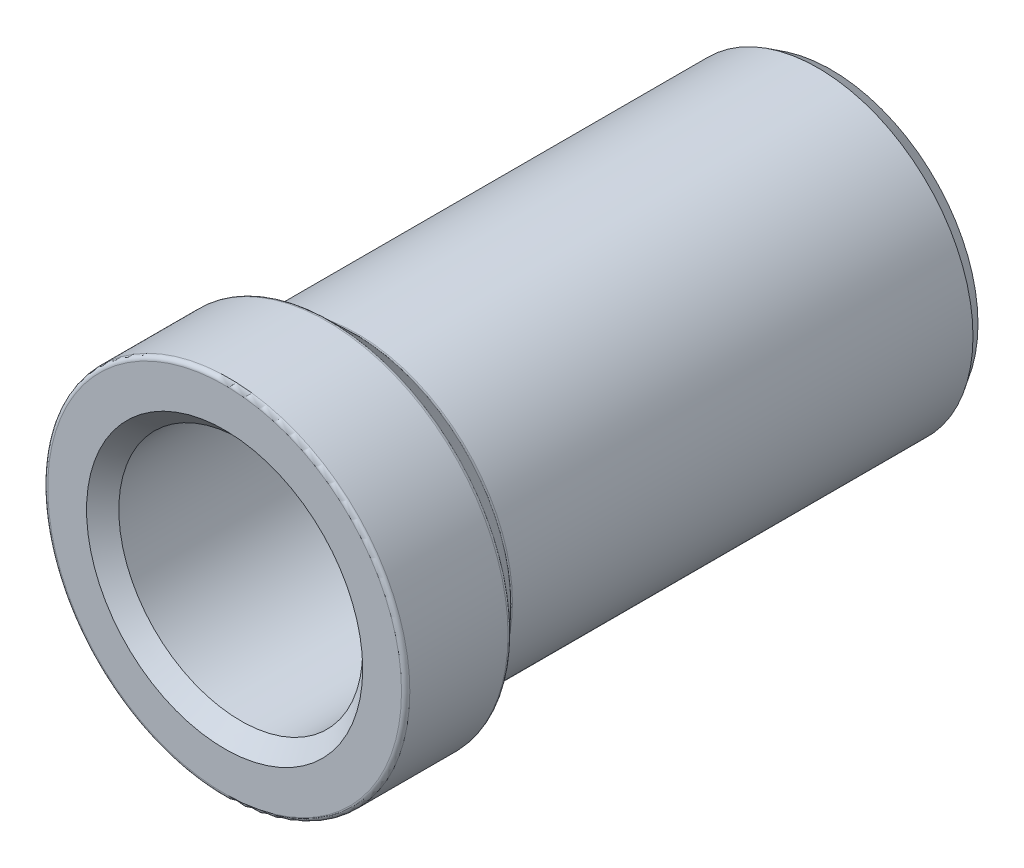
ISO-10303-21;
HEADER;
FILE_DESCRIPTION(('STEP AP214'),'2;1');
FILE_NAME('part.step','',(''),(''),'','','');
FILE_SCHEMA(('AUTOMOTIVE_DESIGN { 1 0 10303 214 1 1 1 1 }'));
ENDSEC;
DATA;
#1=APPLICATION_CONTEXT('core data for automotive mechanical design processes');
#2=APPLICATION_PROTOCOL_DEFINITION('international standard','automotive_design',2000,#1);
#3=PRODUCT_CONTEXT('',#1,'mechanical');
#4=PRODUCT('Part','Part','',(#3));
#5=PRODUCT_RELATED_PRODUCT_CATEGORY('part','',(#4));
#6=PRODUCT_DEFINITION_FORMATION('','',#4);
#7=PRODUCT_DEFINITION_CONTEXT('part definition',#1,'design');
#8=PRODUCT_DEFINITION('design','',#6,#7);
#9=PRODUCT_DEFINITION_SHAPE('','',#8);
#10=(LENGTH_UNIT() NAMED_UNIT(*) SI_UNIT(.MILLI.,.METRE.));
#11=(NAMED_UNIT(*) PLANE_ANGLE_UNIT() SI_UNIT($,.RADIAN.));
#12=(NAMED_UNIT(*) SI_UNIT($,.STERADIAN.) SOLID_ANGLE_UNIT());
#13=UNCERTAINTY_MEASURE_WITH_UNIT(LENGTH_MEASURE(1.E-05),#10,'distance_accuracy_value','');
#14=(GEOMETRIC_REPRESENTATION_CONTEXT(3) GLOBAL_UNCERTAINTY_ASSIGNED_CONTEXT((#13)) GLOBAL_UNIT_ASSIGNED_CONTEXT((#10,
#11,#12)) REPRESENTATION_CONTEXT('',''));
#15=CARTESIAN_POINT('',(0.,0.,0.));
#16=DIRECTION('',(0.,0.,1.));
#17=DIRECTION('',(1.,0.,0.));
#18=AXIS2_PLACEMENT_3D('',#15,#16,#17);
#19=CARTESIAN_POINT('',(0.,0.,74.041));
#20=DIRECTION('',(0.,0.,-1.));
#21=DIRECTION('',(-1.,0.,0.));
#22=AXIS2_PLACEMENT_3D('',#19,#20,#21);
#23=CYLINDRICAL_SURFACE('',#22,18.923);
#24=CARTESIAN_POINT('',(0.,0.,1.62593988150574));
#25=DIRECTION('',(0.,0.,1.));
#26=DIRECTION('',(1.,0.,0.));
#27=AXIS2_PLACEMENT_3D('',#24,#25,#26);
#28=CIRCLE('',#27,18.923);
#29=CARTESIAN_POINT('',(18.923,0.,1.62593988150574));
#30=VERTEX_POINT('',#29);
#31=EDGE_CURVE('E60',#30,#30,#28,.T.);
#32=ORIENTED_EDGE('',*,*,#31,.T.);
#33=EDGE_LOOP('',(#32));
#34=FACE_BOUND('',#33,.T.);
#35=CARTESIAN_POINT('',(0.,0.,57.8343902472951));
#36=DIRECTION('',(0.,0.,1.));
#37=DIRECTION('',(1.,0.,0.));
#38=AXIS2_PLACEMENT_3D('',#35,#36,#37);
#39=CIRCLE('',#38,18.923);
#40=CARTESIAN_POINT('',(18.923,0.,57.8343902472951));
#41=VERTEX_POINT('',#40);
#42=EDGE_CURVE('E78',#41,#41,#39,.F.);
#43=ORIENTED_EDGE('',*,*,#42,.T.);
#44=EDGE_LOOP('',(#43));
#45=FACE_BOUND('',#44,.T.);
#46=ADVANCED_FACE('F40',(#34,#45),#23,.T.);
#47=CARTESIAN_POINT('',(0.,0.,0.));
#48=DIRECTION('',(0.,0.,1.));
#49=DIRECTION('',(1.,0.,0.));
#50=AXIS2_PLACEMENT_3D('',#47,#48,#49);
#51=PLANE('',#50);
#52=CARTESIAN_POINT('',(0.,0.,0.));
#53=DIRECTION('',(0.,0.,1.));
#54=DIRECTION('',(1.,0.,0.));
#55=AXIS2_PLACEMENT_3D('',#52,#53,#54);
#56=CIRCLE('',#55,15.621);
#57=CARTESIAN_POINT('',(15.621,0.,0.));
#58=VERTEX_POINT('',#57);
#59=EDGE_CURVE('E10',#58,#58,#56,.T.);
#60=ORIENTED_EDGE('',*,*,#59,.T.);
#61=EDGE_LOOP('',(#60));
#62=FACE_BOUND('',#61,.T.);
#63=CARTESIAN_POINT('',(0.,0.,0.));
#64=DIRECTION('',(0.,0.,1.));
#65=DIRECTION('',(1.,0.,0.));
#66=AXIS2_PLACEMENT_3D('',#63,#64,#65);
#67=CIRCLE('',#66,17.907);
#68=CARTESIAN_POINT('',(17.907,0.,0.));
#69=VERTEX_POINT('',#68);
#70=EDGE_CURVE('E54',#69,#69,#67,.F.);
#71=ORIENTED_EDGE('',*,*,#70,.T.);
#72=EDGE_LOOP('',(#71));
#73=FACE_BOUND('',#72,.T.);
#74=ADVANCED_FACE('F132',(#62,#73),#51,.F.);
#75=CARTESIAN_POINT('',(0.,0.,0.));
#76=DIRECTION('',(0.,0.,-1.));
#77=DIRECTION('',(-1.,0.,0.));
#78=AXIS2_PLACEMENT_3D('',#75,#76,#77);
#79=CYLINDRICAL_SURFACE('',#78,22.098);
#80=CARTESIAN_POINT('',(0.,0.,61.5456097527048));
#81=DIRECTION('',(0.,0.,1.));
#82=DIRECTION('',(1.,0.,0.));
#83=AXIS2_PLACEMENT_3D('',#80,#81,#82);
#84=CIRCLE('',#83,22.098);
#85=CARTESIAN_POINT('',(22.098,0.,61.5456097527048));
#86=VERTEX_POINT('',#85);
#87=EDGE_CURVE('E70',#86,#86,#84,.T.);
#88=ORIENTED_EDGE('',*,*,#87,.T.);
#89=EDGE_LOOP('',(#88));
#90=FACE_BOUND('',#89,.T.);
#91=CARTESIAN_POINT('',(0.,0.,73.533));
#92=DIRECTION('',(0.,0.,1.));
#93=DIRECTION('',(1.,0.,0.));
#94=AXIS2_PLACEMENT_3D('',#91,#92,#93);
#95=CIRCLE('',#94,22.098);
#96=CARTESIAN_POINT('',(22.098,0.,73.533));
#97=VERTEX_POINT('',#96);
#98=EDGE_CURVE('E74',#97,#97,#95,.F.);
#99=ORIENTED_EDGE('',*,*,#98,.T.);
#100=EDGE_LOOP('',(#99));
#101=FACE_BOUND('',#100,.T.);
#102=ADVANCED_FACE('F130',(#90,#101),#79,.T.);
#103=CARTESIAN_POINT('',(0.,0.,61.341));
#104=DIRECTION('',(0.,0.,1.));
#105=DIRECTION('',(1.,0.,0.));
#106=AXIS2_PLACEMENT_3D('',#103,#104,#105);
#107=CONICAL_SURFACE('',#106,22.098,0.765792832540243);
#108=CARTESIAN_POINT('',(0.,0.,58.186489475151));
#109=DIRECTION('',(0.,0.,1.));
#110=DIRECTION('',(1.,0.,0.));
#111=AXIS2_PLACEMENT_3D('',#108,#109,#110);
#112=CIRCLE('',#111,19.0648168030299);
#113=CARTESIAN_POINT('',(19.0648168030299,0.,58.186489475151));
#114=VERTEX_POINT('',#113);
#115=EDGE_CURVE('E82',#114,#114,#112,.T.);
#116=ORIENTED_EDGE('',*,*,#115,.T.);
#117=EDGE_LOOP('',(#116));
#118=FACE_BOUND('',#117,.T.);
#119=CARTESIAN_POINT('',(0.,0.,61.1935105248489));
#120=DIRECTION('',(0.,0.,-1.));
#121=DIRECTION('',(-1.,0.,0.));
#122=AXIS2_PLACEMENT_3D('',#119,#120,#121);
#123=CIRCLE('',#122,21.9561831969701);
#124=CARTESIAN_POINT('',(-21.9561831969701,0.,61.1935105248489));
#125=VERTEX_POINT('',#124);
#126=EDGE_CURVE('E86',#125,#125,#123,.T.);
#127=ORIENTED_EDGE('',*,*,#126,.T.);
#128=EDGE_LOOP('',(#127));
#129=FACE_BOUND('',#128,.T.);
#130=ADVANCED_FACE('F118',(#118,#129),#107,.T.);
#131=CARTESIAN_POINT('',(0.,0.,74.041));
#132=DIRECTION('',(0.,0.,1.));
#133=DIRECTION('',(1.,0.,0.));
#134=AXIS2_PLACEMENT_3D('',#131,#132,#133);
#135=PLANE('',#134);
#136=CARTESIAN_POINT('',(0.,0.,74.041));
#137=DIRECTION('',(0.,0.,1.));
#138=DIRECTION('',(1.,0.,0.));
#139=AXIS2_PLACEMENT_3D('',#136,#137,#138);
#140=CIRCLE('',#139,16.8529);
#141=CARTESIAN_POINT('',(16.8529,0.,74.041));
#142=VERTEX_POINT('',#141);
#143=EDGE_CURVE('E98',#142,#142,#140,.T.);
#144=ORIENTED_EDGE('',*,*,#143,.F.);
#145=EDGE_LOOP('',(#144));
#146=FACE_BOUND('',#145,.T.);
#147=CARTESIAN_POINT('',(0.,0.,74.041));
#148=DIRECTION('',(0.,0.,1.));
#149=DIRECTION('',(1.,0.,0.));
#150=AXIS2_PLACEMENT_3D('',#147,#148,#149);
#151=CIRCLE('',#150,21.59);
#152=CARTESIAN_POINT('',(21.59,0.,74.041));
#153=VERTEX_POINT('',#152);
#154=EDGE_CURVE('E66',#153,#153,#151,.T.);
#155=ORIENTED_EDGE('',*,*,#154,.T.);
#156=EDGE_LOOP('',(#155));
#157=FACE_BOUND('',#156,.T.);
#158=ADVANCED_FACE('F114',(#146,#157),#135,.T.);
#159=CARTESIAN_POINT('',(0.,0.,57.8343902472951));
#160=DIRECTION('',(0.,0.,1.));
#161=DIRECTION('',(1.,0.,0.));
#162=AXIS2_PLACEMENT_3D('',#159,#160,#161);
#163=TOROIDAL_SURFACE('',#162,19.431,0.508);
#164=ORIENTED_EDGE('',*,*,#42,.F.);
#165=EDGE_LOOP('',(#164));
#166=FACE_BOUND('',#165,.T.);
#167=ORIENTED_EDGE('',*,*,#115,.F.);
#168=EDGE_LOOP('',(#167));
#169=FACE_BOUND('',#168,.T.);
#170=ADVANCED_FACE('F117',(#166,#169),#163,.F.);
#171=CARTESIAN_POINT('',(0.,0.,61.5456097527048));
#172=DIRECTION('',(0.,0.,1.));
#173=DIRECTION('',(1.,0.,0.));
#174=AXIS2_PLACEMENT_3D('',#171,#172,#173);
#175=TOROIDAL_SURFACE('',#174,21.59,0.508);
#176=ORIENTED_EDGE('',*,*,#87,.F.);
#177=EDGE_LOOP('',(#176));
#178=FACE_BOUND('',#177,.T.);
#179=ORIENTED_EDGE('',*,*,#126,.F.);
#180=EDGE_LOOP('',(#179));
#181=FACE_BOUND('',#180,.T.);
#182=ADVANCED_FACE('F126',(#178,#181),#175,.T.);
#183=CARTESIAN_POINT('',(0.,0.,73.533));
#184=DIRECTION('',(0.,0.,1.));
#185=DIRECTION('',(1.,0.,0.));
#186=AXIS2_PLACEMENT_3D('',#183,#184,#185);
#187=TOROIDAL_SURFACE('',#186,21.59,0.508);
#188=ORIENTED_EDGE('',*,*,#154,.F.);
#189=EDGE_LOOP('',(#188));
#190=FACE_BOUND('',#189,.T.);
#191=ORIENTED_EDGE('',*,*,#98,.F.);
#192=EDGE_LOOP('',(#191));
#193=FACE_BOUND('',#192,.T.);
#194=ADVANCED_FACE('F122',(#190,#193),#187,.T.);
#195=CARTESIAN_POINT('',(0.,0.,1.62593988150574));
#196=DIRECTION('',(0.,0.,1.));
#197=DIRECTION('',(1.,0.,0.));
#198=AXIS2_PLACEMENT_3D('',#195,#196,#197);
#199=CONICAL_SURFACE('',#198,18.923,0.558505360638188);
#200=ORIENTED_EDGE('',*,*,#70,.F.);
#201=EDGE_LOOP('',(#200));
#202=FACE_BOUND('',#201,.T.);
#203=ORIENTED_EDGE('',*,*,#31,.F.);
#204=EDGE_LOOP('',(#203));
#205=FACE_BOUND('',#204,.T.);
#206=ADVANCED_FACE('F125',(#202,#205),#199,.T.);
#207=CARTESIAN_POINT('',(0.,0.,12.7));
#208=DIRECTION('',(0.,0.,-1.));
#209=DIRECTION('',(-1.,0.,0.));
#210=AXIS2_PLACEMENT_3D('',#207,#208,#209);
#211=CYLINDRICAL_SURFACE('',#210,14.859);
#212=CARTESIAN_POINT('',(0.,0.,0.761999999999992));
#213=DIRECTION('',(0.,0.,1.));
#214=DIRECTION('',(1.,0.,0.));
#215=AXIS2_PLACEMENT_3D('',#212,#213,#214);
#216=CIRCLE('',#215,14.859);
#217=CARTESIAN_POINT('',(14.859,0.,0.761999999999992));
#218=VERTEX_POINT('',#217);
#219=EDGE_CURVE('E48',#218,#218,#216,.F.);
#220=ORIENTED_EDGE('',*,*,#219,.T.);
#221=EDGE_LOOP('',(#220));
#222=FACE_BOUND('',#221,.T.);
#223=CARTESIAN_POINT('',(0.,0.,12.7));
#224=DIRECTION('',(0.,0.,-1.));
#225=DIRECTION('',(-1.,0.,0.));
#226=AXIS2_PLACEMENT_3D('',#223,#224,#225);
#227=CIRCLE('',#226,14.859);
#228=CARTESIAN_POINT('',(-14.859,0.,12.7));
#229=VERTEX_POINT('',#228);
#230=EDGE_CURVE('E90',#229,#229,#227,.F.);
#231=ORIENTED_EDGE('',*,*,#230,.T.);
#232=EDGE_LOOP('',(#231));
#233=FACE_BOUND('',#232,.T.);
#234=ADVANCED_FACE('F155',(#222,#233),#211,.F.);
#235=CARTESIAN_POINT('',(0.,0.,0.761999999999992));
#236=DIRECTION('',(0.,0.,-1.));
#237=DIRECTION('',(-1.,0.,0.));
#238=AXIS2_PLACEMENT_3D('',#235,#236,#237);
#239=CONICAL_SURFACE('',#238,14.859,0.785398163397452);
#240=ORIENTED_EDGE('',*,*,#59,.F.);
#241=EDGE_LOOP('',(#240));
#242=FACE_BOUND('',#241,.T.);
#243=ORIENTED_EDGE('',*,*,#219,.F.);
#244=EDGE_LOOP('',(#243));
#245=FACE_BOUND('',#244,.T.);
#246=ADVANCED_FACE('F42',(#242,#245),#239,.F.);
#247=CARTESIAN_POINT('',(0.,0.,12.7));
#248=DIRECTION('',(0.,0.,-1.));
#249=DIRECTION('',(-1.,0.,0.));
#250=AXIS2_PLACEMENT_3D('',#247,#248,#249);
#251=PLANE('',#250);
#252=CARTESIAN_POINT('',(0.,0.,12.7));
#253=DIRECTION('',(0.,0.,-1.));
#254=DIRECTION('',(-1.,0.,0.));
#255=AXIS2_PLACEMENT_3D('',#252,#253,#254);
#256=CIRCLE('',#255,14.88313);
#257=CARTESIAN_POINT('',(-14.88313,0.,12.7));
#258=VERTEX_POINT('',#257);
#259=EDGE_CURVE('E95',#258,#258,#256,.F.);
#260=ORIENTED_EDGE('',*,*,#259,.T.);
#261=EDGE_LOOP('',(#260));
#262=FACE_BOUND('',#261,.T.);
#263=ORIENTED_EDGE('',*,*,#230,.F.);
#264=EDGE_LOOP('',(#263));
#265=FACE_BOUND('',#264,.T.);
#266=ADVANCED_FACE('F168',(#262,#265),#251,.F.);
#267=CARTESIAN_POINT('',(0.,0.,74.041));
#268=DIRECTION('',(0.,0.,1.));
#269=DIRECTION('',(1.,0.,0.));
#270=AXIS2_PLACEMENT_3D('',#267,#268,#269);
#271=CYLINDRICAL_SURFACE('',#270,14.88313);
#272=CARTESIAN_POINT('',(0.,0.,72.07123));
#273=DIRECTION('',(0.,0.,1.));
#274=DIRECTION('',(1.,0.,0.));
#275=AXIS2_PLACEMENT_3D('',#272,#273,#274);
#276=CIRCLE('',#275,14.88313);
#277=CARTESIAN_POINT('',(14.88313,0.,72.07123));
#278=VERTEX_POINT('',#277);
#279=EDGE_CURVE('E94',#278,#278,#276,.T.);
#280=ORIENTED_EDGE('',*,*,#279,.T.);
#281=EDGE_LOOP('',(#280));
#282=FACE_BOUND('',#281,.T.);
#283=ORIENTED_EDGE('',*,*,#259,.F.);
#284=EDGE_LOOP('',(#283));
#285=FACE_BOUND('',#284,.T.);
#286=ADVANCED_FACE('F105',(#282,#285),#271,.F.);
#287=CARTESIAN_POINT('',(0.,0.,74.041));
#288=DIRECTION('',(0.,0.,1.));
#289=DIRECTION('',(1.,0.,0.));
#290=AXIS2_PLACEMENT_3D('',#287,#288,#289);
#291=CONICAL_SURFACE('',#290,16.8529,0.785398163397447);
#292=ORIENTED_EDGE('',*,*,#279,.F.);
#293=EDGE_LOOP('',(#292));
#294=FACE_BOUND('',#293,.T.);
#295=ORIENTED_EDGE('',*,*,#143,.T.);
#296=EDGE_LOOP('',(#295));
#297=FACE_BOUND('',#296,.T.);
#298=ADVANCED_FACE('F108',(#294,#297),#291,.F.);
#299=CLOSED_SHELL('',(#46,#74,#102,#130,#158,#170,#182,#194,#206,#234,#246,#266,#286,#298));
#300=MANIFOLD_SOLID_BREP('B2',#299);
#301=ADVANCED_BREP_SHAPE_REPRESENTATION('',(#18,#300),#14);
#302=SHAPE_DEFINITION_REPRESENTATION(#9,#301);
ENDSEC;
END-ISO-10303-21;
